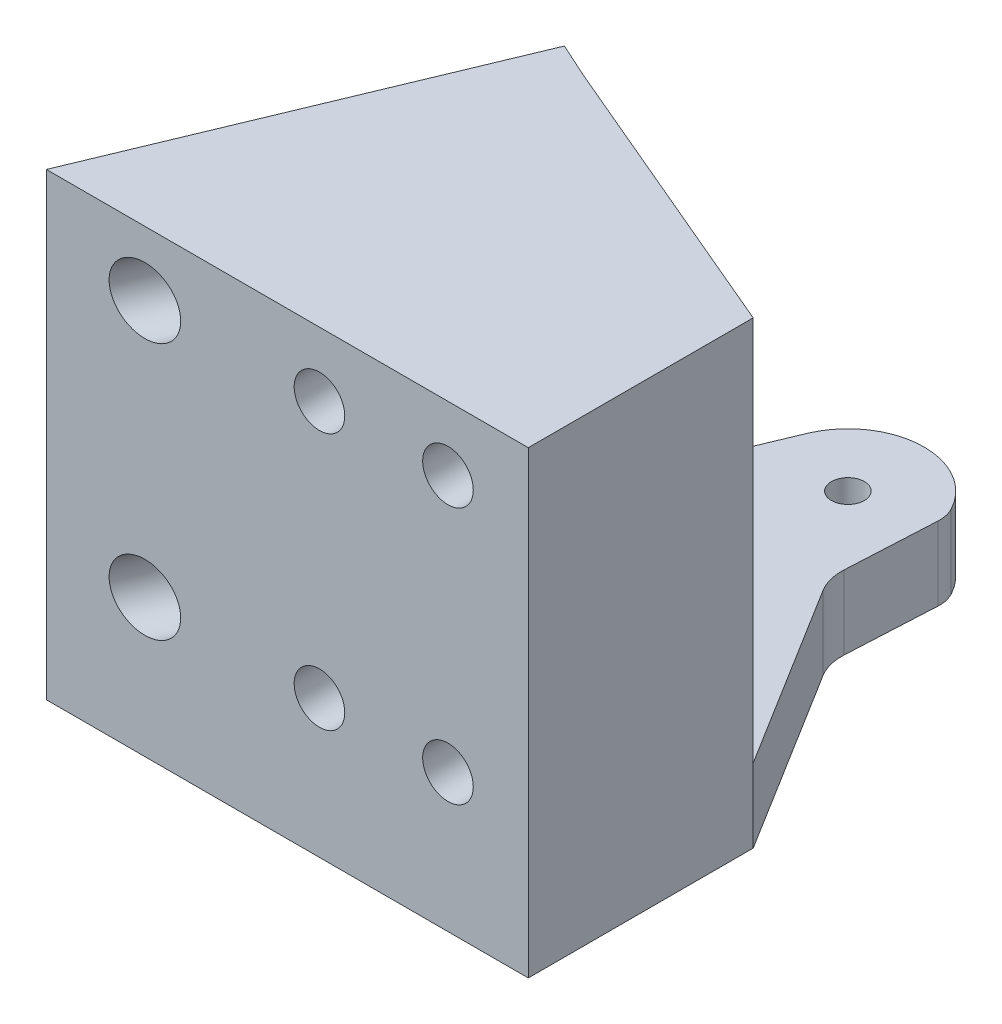
ISO-10303-21;
HEADER;
FILE_DESCRIPTION(('STEP AP214'),'2;1');
FILE_NAME('part.step','',(''),(''),'','','');
FILE_SCHEMA(('AUTOMOTIVE_DESIGN { 1 0 10303 214 1 1 1 1 }'));
ENDSEC;
DATA;
#1=APPLICATION_CONTEXT('core data for automotive mechanical design processes');
#2=APPLICATION_PROTOCOL_DEFINITION('international standard','automotive_design',2000,#1);
#3=PRODUCT_CONTEXT('',#1,'mechanical');
#4=PRODUCT('Part','Part','',(#3));
#5=PRODUCT_RELATED_PRODUCT_CATEGORY('part','',(#4));
#6=PRODUCT_DEFINITION_FORMATION('','',#4);
#7=PRODUCT_DEFINITION_CONTEXT('part definition',#1,'design');
#8=PRODUCT_DEFINITION('design','',#6,#7);
#9=PRODUCT_DEFINITION_SHAPE('','',#8);
#10=(LENGTH_UNIT() NAMED_UNIT(*) SI_UNIT(.MILLI.,.METRE.));
#11=(NAMED_UNIT(*) PLANE_ANGLE_UNIT() SI_UNIT($,.RADIAN.));
#12=(NAMED_UNIT(*) SI_UNIT($,.STERADIAN.) SOLID_ANGLE_UNIT());
#13=UNCERTAINTY_MEASURE_WITH_UNIT(LENGTH_MEASURE(1.E-05),#10,'distance_accuracy_value','');
#14=(GEOMETRIC_REPRESENTATION_CONTEXT(3) GLOBAL_UNCERTAINTY_ASSIGNED_CONTEXT((#13)) GLOBAL_UNIT_ASSIGNED_CONTEXT((#10,
#11,#12)) REPRESENTATION_CONTEXT('',''));
#15=CARTESIAN_POINT('',(0.,0.,0.));
#16=DIRECTION('',(0.,0.,1.));
#17=DIRECTION('',(1.,0.,0.));
#18=AXIS2_PLACEMENT_3D('',#15,#16,#17);
#19=CARTESIAN_POINT('',(0.,0.,0.));
#20=DIRECTION('',(0.,-1.,0.));
#21=DIRECTION('',(0.,0.,-1.));
#22=AXIS2_PLACEMENT_3D('',#19,#20,#21);
#23=PLANE('',#22);
#24=CARTESIAN_POINT('',(13.39,0.,-19.59));
#25=DIRECTION('',(0.,-1.,0.));
#26=DIRECTION('',(0.,0.,-1.));
#27=AXIS2_PLACEMENT_3D('',#24,#25,#26);
#28=CIRCLE('',#27,2.05);
#29=CARTESIAN_POINT('',(13.39,0.,-21.64));
#30=VERTEX_POINT('',#29);
#31=EDGE_CURVE('E172',#30,#30,#28,.T.);
#32=ORIENTED_EDGE('',*,*,#31,.T.);
#33=EDGE_LOOP('',(#32));
#34=FACE_BOUND('',#33,.T.);
#35=DIRECTION('',(-0.910085172918903,0.,-0.414421256734219));
#36=VECTOR('',#35,1.);
#37=CARTESIAN_POINT('',(0.,0.,0.));
#38=LINE('',#37,#36);
#39=CARTESIAN_POINT('',(0.,0.,0.));
#40=VERTEX_POINT('',#39);
#41=CARTESIAN_POINT('',(-4.23961622686856,0.,-1.93057434303044));
#42=VERTEX_POINT('',#41);
#43=EDGE_CURVE('E151',#40,#42,#38,.T.);
#44=ORIENTED_EDGE('',*,*,#43,.F.);
#45=DIRECTION('',(-0.920504853452443,0.,-0.390731128489268));
#46=VECTOR('',#45,1.);
#47=CARTESIAN_POINT('',(36.8201941380977,0.,15.6292451395707));
#48=LINE('',#47,#46);
#49=CARTESIAN_POINT('',(36.8201941380977,0.,15.6292451395707));
#50=VERTEX_POINT('',#49);
#51=EDGE_CURVE('E225',#50,#40,#48,.T.);
#52=ORIENTED_EDGE('',*,*,#51,.F.);
#53=DIRECTION('',(0.527710960217974,0.,0.849424006292396));
#54=VECTOR('',#53,1.);
#55=CARTESIAN_POINT('',(19.5607338113645,0.,-12.1522508731759));
#56=LINE('',#55,#54);
#57=CARTESIAN_POINT('',(22.5481581017996,0.,-7.34357699566459));
#58=VERTEX_POINT('',#57);
#59=EDGE_CURVE('E196',#58,#50,#56,.T.);
#60=ORIENTED_EDGE('',*,*,#59,.F.);
#61=CARTESIAN_POINT('',(27.644702139554,0.,-10.5098427569724));
#62=DIRECTION('',(0.,-1.,0.));
#63=DIRECTION('',(0.,0.,-1.));
#64=AXIS2_PLACEMENT_3D('',#61,#62,#63);
#65=CIRCLE('',#64,6.);
#66=CARTESIAN_POINT('',(21.6527019401257,0.,-10.8195742698201));
#67=VERTEX_POINT('',#66);
#68=EDGE_CURVE('E49',#58,#67,#65,.T.);
#69=ORIENTED_EDGE('',*,*,#68,.T.);
#70=DIRECTION('',(-0.051621918807937,0.,0.998666699904721));
#71=VECTOR('',#70,1.);
#72=CARTESIAN_POINT('',(21.0372188326345,0.,1.0874314750123));
#73=LINE('',#72,#71);
#74=CARTESIAN_POINT('',(22.2299105121146,0.,-21.9861289631768));
#75=VERTEX_POINT('',#74);
#76=EDGE_CURVE('E194',#75,#67,#73,.T.);
#77=ORIENTED_EDGE('',*,*,#76,.F.);
#78=CARTESIAN_POINT('',(18.2352437124957,0.,-22.1926166384086));
#79=DIRECTION('',(0.,-1.,0.));
#80=DIRECTION('',(0.,0.,-1.));
#81=AXIS2_PLACEMENT_3D('',#78,#79,#80);
#82=CIRCLE('',#81,4.);
#83=CARTESIAN_POINT('',(21.7590573215834,0.,-24.0854287390694));
#84=VERTEX_POINT('',#83);
#85=EDGE_CURVE('E252',#75,#84,#82,.F.);
#86=ORIENTED_EDGE('',*,*,#85,.T.);
#87=CARTESIAN_POINT('',(13.39,0.,-19.59));
#88=DIRECTION('',(0.,-1.,0.));
#89=DIRECTION('',(0.,0.,-1.));
#90=AXIS2_PLACEMENT_3D('',#87,#88,#89);
#91=CIRCLE('',#90,9.50000000000001);
#92=CARTESIAN_POINT('',(4.61782799973068,0.,-23.2367791813724));
#93=VERTEX_POINT('',#92);
#94=EDGE_CURVE('E190',#93,#84,#91,.T.);
#95=ORIENTED_EDGE('',*,*,#94,.F.);
#96=DIRECTION('',(0.383871492776041,0.,-0.923386526344138));
#97=VECTOR('',#96,1.);
#98=CARTESIAN_POINT('',(-4.29919251697204,0.,-1.78726611460927));
#99=LINE('',#98,#97);
#100=EDGE_CURVE('E188',#42,#93,#99,.T.);
#101=ORIENTED_EDGE('',*,*,#100,.F.);
#102=EDGE_LOOP('',(#44,#52,#60,#69,#77,#86,#95,#101));
#103=FACE_BOUND('',#102,.T.);
#104=ADVANCED_FACE('F40',(#34,#103),#23,.F.);
#105=CARTESIAN_POINT('',(36.8201941380977,48.,15.6292451395707));
#106=DIRECTION('',(-0.390731128489268,0.,0.920504853452443));
#107=DIRECTION('',(0.920504853452443,0.,0.390731128489268));
#108=AXIS2_PLACEMENT_3D('',#105,#106,#107);
#109=PLANE('',#108);
#110=CARTESIAN_POINT('',(6.44353397416709,40.,2.73511789942487));
#111=DIRECTION('',(0.390731128489268,0.,-0.920504853452443));
#112=DIRECTION('',(-0.920504853452443,0.,-0.390731128489268));
#113=AXIS2_PLACEMENT_3D('',#110,#111,#112);
#114=CIRCLE('',#113,2.05);
#115=CARTESIAN_POINT('',(4.55649902458958,40.,1.93411908602187));
#116=VERTEX_POINT('',#115);
#117=EDGE_CURVE('E270',#116,#116,#114,.T.);
#118=ORIENTED_EDGE('',*,*,#117,.F.);
#119=EDGE_LOOP('',(#118));
#120=FACE_BOUND('',#119,.T.);
#121=CARTESIAN_POINT('',(6.44353397416709,8.,2.73511789942487));
#122=DIRECTION('',(0.390731128489268,0.,-0.920504853452443));
#123=DIRECTION('',(-0.920504853452443,0.,-0.390731128489268));
#124=AXIS2_PLACEMENT_3D('',#121,#122,#123);
#125=CIRCLE('',#124,2.05);
#126=CARTESIAN_POINT('',(4.55649902458958,8.,1.93411908602187));
#127=VERTEX_POINT('',#126);
#128=EDGE_CURVE('E276',#127,#127,#125,.T.);
#129=ORIENTED_EDGE('',*,*,#128,.F.);
#130=EDGE_LOOP('',(#129));
#131=FACE_BOUND('',#130,.T.);
#132=ORIENTED_EDGE('',*,*,#51,.T.);
#133=DIRECTION('',(0.,-1.,0.));
#134=VECTOR('',#133,1.);
#135=CARTESIAN_POINT('',(0.,48.,0.));
#136=LINE('',#135,#134);
#137=CARTESIAN_POINT('',(0.,48.,0.));
#138=VERTEX_POINT('',#137);
#139=EDGE_CURVE('E236',#138,#40,#136,.T.);
#140=ORIENTED_EDGE('',*,*,#139,.F.);
#141=DIRECTION('',(-0.920504853452443,0.,-0.390731128489268));
#142=VECTOR('',#141,1.);
#143=CARTESIAN_POINT('',(36.8201941380977,48.,15.6292451395707));
#144=LINE('',#143,#142);
#145=CARTESIAN_POINT('',(36.8201941380977,48.,15.6292451395707));
#146=VERTEX_POINT('',#145);
#147=EDGE_CURVE('E132',#146,#138,#144,.T.);
#148=ORIENTED_EDGE('',*,*,#147,.F.);
#149=DIRECTION('',(0.,-1.,0.));
#150=VECTOR('',#149,1.);
#151=CARTESIAN_POINT('',(36.8201941380977,48.,15.6292451395707));
#152=LINE('',#151,#150);
#153=EDGE_CURVE('E230',#146,#50,#152,.T.);
#154=ORIENTED_EDGE('',*,*,#153,.T.);
#155=EDGE_LOOP('',(#132,#140,#148,#154));
#156=FACE_BOUND('',#155,.T.);
#157=ADVANCED_FACE('F293',(#120,#131,#156),#109,.F.);
#158=CARTESIAN_POINT('',(0.,48.,43.6292451395707));
#159=DIRECTION('',(0.,0.,-1.));
#160=DIRECTION('',(-1.,0.,0.));
#161=AXIS2_PLACEMENT_3D('',#158,#159,#160);
#162=PLANE('',#161);
#163=CARTESIAN_POINT('',(-10.9149931701457,40.,43.6292451395707));
#164=DIRECTION('',(0.,0.,-1.));
#165=DIRECTION('',(1.,0.,0.));
#166=AXIS2_PLACEMENT_3D('',#163,#164,#165);
#167=ELLIPSE('',#166,4.4540775473617,4.1);
#168=CARTESIAN_POINT('',(-6.460915622784,40.,43.6292451395707));
#169=VERTEX_POINT('',#168);
#170=EDGE_CURVE('E153',#169,#169,#167,.T.);
#171=ORIENTED_EDGE('',*,*,#170,.T.);
#172=EDGE_LOOP('',(#171));
#173=FACE_BOUND('',#172,.T.);
#174=CARTESIAN_POINT('',(-10.9149931701457,8.,43.6292451395707));
#175=DIRECTION('',(0.,0.,-1.));
#176=DIRECTION('',(1.,0.,0.));
#177=AXIS2_PLACEMENT_3D('',#174,#175,#176);
#178=ELLIPSE('',#177,4.4540775473617,4.1);
#179=CARTESIAN_POINT('',(-6.460915622784,8.,43.6292451395707));
#180=VERTEX_POINT('',#179);
#181=EDGE_CURVE('E263',#180,#180,#178,.T.);
#182=ORIENTED_EDGE('',*,*,#181,.T.);
#183=EDGE_LOOP('',(#182));
#184=FACE_BOUND('',#183,.T.);
#185=CARTESIAN_POINT('',(10.8201941380977,8.,43.6292451395707));
#186=DIRECTION('',(0.,0.,1.));
#187=DIRECTION('',(1.,0.,0.));
#188=AXIS2_PLACEMENT_3D('',#185,#186,#187);
#189=CIRCLE('',#188,3.15);
#190=CARTESIAN_POINT('',(13.9701941380977,8.,43.6292451395707));
#191=VERTEX_POINT('',#190);
#192=EDGE_CURVE('E142',#191,#191,#189,.T.);
#193=ORIENTED_EDGE('',*,*,#192,.F.);
#194=EDGE_LOOP('',(#193));
#195=FACE_BOUND('',#194,.T.);
#196=CARTESIAN_POINT('',(26.8201941380977,8.,43.6292451395707));
#197=DIRECTION('',(0.,0.,1.));
#198=DIRECTION('',(1.,0.,0.));
#199=AXIS2_PLACEMENT_3D('',#196,#197,#198);
#200=CIRCLE('',#199,3.14999999999998);
#201=CARTESIAN_POINT('',(29.9701941380977,8.,43.6292451395707));
#202=VERTEX_POINT('',#201);
#203=EDGE_CURVE('E214',#202,#202,#200,.T.);
#204=ORIENTED_EDGE('',*,*,#203,.F.);
#205=EDGE_LOOP('',(#204));
#206=FACE_BOUND('',#205,.T.);
#207=CARTESIAN_POINT('',(26.8201941380977,40.,43.6292451395707));
#208=DIRECTION('',(0.,0.,1.));
#209=DIRECTION('',(1.,0.,0.));
#210=AXIS2_PLACEMENT_3D('',#207,#208,#209);
#211=CIRCLE('',#210,3.14999999999998);
#212=CARTESIAN_POINT('',(29.9701941380977,40.,43.6292451395707));
#213=VERTEX_POINT('',#212);
#214=EDGE_CURVE('E208',#213,#213,#211,.T.);
#215=ORIENTED_EDGE('',*,*,#214,.F.);
#216=EDGE_LOOP('',(#215));
#217=FACE_BOUND('',#216,.T.);
#218=CARTESIAN_POINT('',(10.8201941380977,40.,43.6292451395707));
#219=DIRECTION('',(0.,0.,1.));
#220=DIRECTION('',(1.,0.,0.));
#221=AXIS2_PLACEMENT_3D('',#218,#219,#220);
#222=CIRCLE('',#221,3.15);
#223=CARTESIAN_POINT('',(13.9701941380977,40.,43.6292451395707));
#224=VERTEX_POINT('',#223);
#225=EDGE_CURVE('E207',#224,#224,#222,.T.);
#226=ORIENTED_EDGE('',*,*,#225,.F.);
#227=EDGE_LOOP('',(#226));
#228=FACE_BOUND('',#227,.T.);
#229=DIRECTION('',(1.,0.,0.));
#230=VECTOR('',#229,1.);
#231=CARTESIAN_POINT('',(0.,48.,43.6292451395707));
#232=LINE('',#231,#230);
#233=CARTESIAN_POINT('',(-23.1798058619023,48.,43.6292451395707));
#234=VERTEX_POINT('',#233);
#235=CARTESIAN_POINT('',(36.8201941380977,48.,43.6292451395707));
#236=VERTEX_POINT('',#235);
#237=EDGE_CURVE('E122',#234,#236,#232,.T.);
#238=ORIENTED_EDGE('',*,*,#237,.F.);
#239=DIRECTION('',(0.,1.,0.));
#240=VECTOR('',#239,1.);
#241=CARTESIAN_POINT('',(-23.1798058619023,-9.18,43.6292451395707));
#242=LINE('',#241,#240);
#243=CARTESIAN_POINT('',(-23.1798058619023,-9.18,43.6292451395707));
#244=VERTEX_POINT('',#243);
#245=EDGE_CURVE('E126',#244,#234,#242,.T.);
#246=ORIENTED_EDGE('',*,*,#245,.F.);
#247=DIRECTION('',(-1.,0.,0.));
#248=VECTOR('',#247,1.);
#249=CARTESIAN_POINT('',(0.,-9.18,43.6292451395707));
#250=LINE('',#249,#248);
#251=CARTESIAN_POINT('',(36.8201941380977,-9.18,43.6292451395707));
#252=VERTEX_POINT('',#251);
#253=EDGE_CURVE('E170',#252,#244,#250,.T.);
#254=ORIENTED_EDGE('',*,*,#253,.F.);
#255=DIRECTION('',(0.,-1.,0.));
#256=VECTOR('',#255,1.);
#257=CARTESIAN_POINT('',(36.8201941380977,48.,43.6292451395707));
#258=LINE('',#257,#256);
#259=EDGE_CURVE('E127',#236,#252,#258,.T.);
#260=ORIENTED_EDGE('',*,*,#259,.F.);
#261=EDGE_LOOP('',(#238,#246,#254,#260));
#262=FACE_BOUND('',#261,.T.);
#263=ADVANCED_FACE('F124',(#173,#184,#195,#206,#217,#228,#262),#162,.F.);
#264=CARTESIAN_POINT('',(36.8201941380977,48.,15.6292451395707));
#265=DIRECTION('',(-1.,0.,0.));
#266=DIRECTION('',(0.,0.,1.));
#267=AXIS2_PLACEMENT_3D('',#264,#265,#266);
#268=PLANE('',#267);
#269=ORIENTED_EDGE('',*,*,#259,.T.);
#270=DIRECTION('',(0.,0.,1.));
#271=VECTOR('',#270,1.);
#272=CARTESIAN_POINT('',(36.8201941380977,-9.18,0.));
#273=LINE('',#272,#271);
#274=CARTESIAN_POINT('',(36.8201941380977,-9.18,15.6292451395707));
#275=VERTEX_POINT('',#274);
#276=EDGE_CURVE('E181',#275,#252,#273,.T.);
#277=ORIENTED_EDGE('',*,*,#276,.F.);
#278=DIRECTION('',(0.,1.,0.));
#279=VECTOR('',#278,1.);
#280=CARTESIAN_POINT('',(36.8201941380977,-9.18,15.6292451395707));
#281=LINE('',#280,#279);
#282=EDGE_CURVE('E187',#275,#50,#281,.T.);
#283=ORIENTED_EDGE('',*,*,#282,.T.);
#284=ORIENTED_EDGE('',*,*,#153,.F.);
#285=DIRECTION('',(0.,0.,-1.));
#286=VECTOR('',#285,1.);
#287=CARTESIAN_POINT('',(36.8201941380977,48.,15.6292451395707));
#288=LINE('',#287,#286);
#289=EDGE_CURVE('E131',#236,#146,#288,.T.);
#290=ORIENTED_EDGE('',*,*,#289,.F.);
#291=EDGE_LOOP('',(#269,#277,#283,#284,#290));
#292=FACE_BOUND('',#291,.T.);
#293=ADVANCED_FACE('F297',(#292),#268,.F.);
#294=CARTESIAN_POINT('',(0.,48.,0.));
#295=DIRECTION('',(0.,1.,0.));
#296=DIRECTION('',(0.,0.,1.));
#297=AXIS2_PLACEMENT_3D('',#294,#295,#296);
#298=PLANE('',#297);
#299=ORIENTED_EDGE('',*,*,#147,.T.);
#300=DIRECTION('',(-0.910085172918903,0.,-0.414421256734219));
#301=VECTOR('',#300,1.);
#302=CARTESIAN_POINT('',(0.,48.,0.));
#303=LINE('',#302,#301);
#304=CARTESIAN_POINT('',(-4.23961622686856,48.,-1.93057434303044));
#305=VERTEX_POINT('',#304);
#306=EDGE_CURVE('E147',#138,#305,#303,.T.);
#307=ORIENTED_EDGE('',*,*,#306,.T.);
#308=DIRECTION('',(0.383871492776041,0.,-0.923386526344138));
#309=VECTOR('',#308,1.);
#310=CARTESIAN_POINT('',(-4.29919251697204,48.,-1.78726611460927));
#311=LINE('',#310,#309);
#312=EDGE_CURVE('E138',#234,#305,#311,.T.);
#313=ORIENTED_EDGE('',*,*,#312,.F.);
#314=ORIENTED_EDGE('',*,*,#237,.T.);
#315=ORIENTED_EDGE('',*,*,#289,.T.);
#316=EDGE_LOOP('',(#299,#307,#313,#314,#315));
#317=FACE_BOUND('',#316,.T.);
#318=ADVANCED_FACE('F145',(#317),#298,.T.);
#319=CARTESIAN_POINT('',(10.8201941380977,40.,38.9292451395707));
#320=DIRECTION('',(0.,0.,1.));
#321=DIRECTION('',(1.,0.,0.));
#322=AXIS2_PLACEMENT_3D('',#319,#320,#321);
#323=CYLINDRICAL_SURFACE('',#322,3.15);
#324=CARTESIAN_POINT('',(10.8201941380977,40.,38.9292451395707));
#325=DIRECTION('',(0.,0.,1.));
#326=DIRECTION('',(1.,0.,0.));
#327=AXIS2_PLACEMENT_3D('',#324,#325,#326);
#328=CIRCLE('',#327,3.15);
#329=CARTESIAN_POINT('',(13.9701941380977,40.,38.9292451395707));
#330=VERTEX_POINT('',#329);
#331=EDGE_CURVE('E222',#330,#330,#328,.T.);
#332=ORIENTED_EDGE('',*,*,#331,.F.);
#333=EDGE_LOOP('',(#332));
#334=FACE_BOUND('',#333,.T.);
#335=ORIENTED_EDGE('',*,*,#225,.T.);
#336=EDGE_LOOP('',(#335));
#337=FACE_BOUND('',#336,.T.);
#338=ADVANCED_FACE('F519',(#334,#337),#323,.F.);
#339=CARTESIAN_POINT('',(0.,0.,38.9292451395707));
#340=DIRECTION('',(0.,0.,1.));
#341=DIRECTION('',(1.,0.,0.));
#342=AXIS2_PLACEMENT_3D('',#339,#340,#341);
#343=PLANE('',#342);
#344=CARTESIAN_POINT('',(10.8201941380977,40.,38.9292451395707));
#345=DIRECTION('',(0.,0.,1.));
#346=DIRECTION('',(1.,0.,0.));
#347=AXIS2_PLACEMENT_3D('',#344,#345,#346);
#348=CIRCLE('',#347,2.);
#349=CARTESIAN_POINT('',(12.8201941380977,40.,38.9292451395707));
#350=VERTEX_POINT('',#349);
#351=EDGE_CURVE('E191',#350,#350,#348,.T.);
#352=ORIENTED_EDGE('',*,*,#351,.F.);
#353=EDGE_LOOP('',(#352));
#354=FACE_BOUND('',#353,.T.);
#355=ORIENTED_EDGE('',*,*,#331,.T.);
#356=EDGE_LOOP('',(#355));
#357=FACE_BOUND('',#356,.T.);
#358=ADVANCED_FACE('F610',(#354,#357),#343,.T.);
#359=CARTESIAN_POINT('',(26.8201941380977,40.,38.9292451395707));
#360=DIRECTION('',(0.,0.,1.));
#361=DIRECTION('',(1.,0.,0.));
#362=AXIS2_PLACEMENT_3D('',#359,#360,#361);
#363=CYLINDRICAL_SURFACE('',#362,3.14999999999998);
#364=CARTESIAN_POINT('',(26.8201941380977,40.,38.9292451395707));
#365=DIRECTION('',(0.,0.,1.));
#366=DIRECTION('',(1.,0.,0.));
#367=AXIS2_PLACEMENT_3D('',#364,#365,#366);
#368=CIRCLE('',#367,3.14999999999998);
#369=CARTESIAN_POINT('',(29.9701941380977,40.,38.9292451395707));
#370=VERTEX_POINT('',#369);
#371=EDGE_CURVE('E204',#370,#370,#368,.T.);
#372=ORIENTED_EDGE('',*,*,#371,.F.);
#373=EDGE_LOOP('',(#372));
#374=FACE_BOUND('',#373,.T.);
#375=ORIENTED_EDGE('',*,*,#214,.T.);
#376=EDGE_LOOP('',(#375));
#377=FACE_BOUND('',#376,.T.);
#378=ADVANCED_FACE('F617',(#374,#377),#363,.F.);
#379=CARTESIAN_POINT('',(0.,0.,38.9292451395707));
#380=DIRECTION('',(0.,0.,1.));
#381=DIRECTION('',(1.,0.,0.));
#382=AXIS2_PLACEMENT_3D('',#379,#380,#381);
#383=PLANE('',#382);
#384=CARTESIAN_POINT('',(26.8201941380977,40.,38.9292451395707));
#385=DIRECTION('',(0.,0.,1.));
#386=DIRECTION('',(1.,0.,0.));
#387=AXIS2_PLACEMENT_3D('',#384,#385,#386);
#388=CIRCLE('',#387,2.);
#389=CARTESIAN_POINT('',(28.8201941380977,40.,38.9292451395707));
#390=VERTEX_POINT('',#389);
#391=EDGE_CURVE('E245',#390,#390,#388,.T.);
#392=ORIENTED_EDGE('',*,*,#391,.F.);
#393=EDGE_LOOP('',(#392));
#394=FACE_BOUND('',#393,.T.);
#395=ORIENTED_EDGE('',*,*,#371,.T.);
#396=EDGE_LOOP('',(#395));
#397=FACE_BOUND('',#396,.T.);
#398=ADVANCED_FACE('F625',(#394,#397),#383,.T.);
#399=CARTESIAN_POINT('',(26.8201941380977,8.,38.9292451395707));
#400=DIRECTION('',(0.,0.,1.));
#401=DIRECTION('',(1.,0.,0.));
#402=AXIS2_PLACEMENT_3D('',#399,#400,#401);
#403=CYLINDRICAL_SURFACE('',#402,3.14999999999998);
#404=CARTESIAN_POINT('',(26.8201941380977,8.,38.9292451395707));
#405=DIRECTION('',(0.,0.,1.));
#406=DIRECTION('',(1.,0.,0.));
#407=AXIS2_PLACEMENT_3D('',#404,#405,#406);
#408=CIRCLE('',#407,3.14999999999998);
#409=CARTESIAN_POINT('',(29.9701941380977,8.,38.9292451395707));
#410=VERTEX_POINT('',#409);
#411=EDGE_CURVE('E211',#410,#410,#408,.T.);
#412=ORIENTED_EDGE('',*,*,#411,.F.);
#413=EDGE_LOOP('',(#412));
#414=FACE_BOUND('',#413,.T.);
#415=ORIENTED_EDGE('',*,*,#203,.T.);
#416=EDGE_LOOP('',(#415));
#417=FACE_BOUND('',#416,.T.);
#418=ADVANCED_FACE('F633',(#414,#417),#403,.F.);
#419=CARTESIAN_POINT('',(0.,0.,38.9292451395707));
#420=DIRECTION('',(0.,0.,1.));
#421=DIRECTION('',(1.,0.,0.));
#422=AXIS2_PLACEMENT_3D('',#419,#420,#421);
#423=PLANE('',#422);
#424=CARTESIAN_POINT('',(26.8201941380977,8.,38.9292451395707));
#425=DIRECTION('',(0.,0.,1.));
#426=DIRECTION('',(1.,0.,0.));
#427=AXIS2_PLACEMENT_3D('',#424,#425,#426);
#428=CIRCLE('',#427,2.);
#429=CARTESIAN_POINT('',(28.8201941380977,8.,38.9292451395707));
#430=VERTEX_POINT('',#429);
#431=EDGE_CURVE('E242',#430,#430,#428,.T.);
#432=ORIENTED_EDGE('',*,*,#431,.F.);
#433=EDGE_LOOP('',(#432));
#434=FACE_BOUND('',#433,.T.);
#435=ORIENTED_EDGE('',*,*,#411,.T.);
#436=EDGE_LOOP('',(#435));
#437=FACE_BOUND('',#436,.T.);
#438=ADVANCED_FACE('F641',(#434,#437),#423,.T.);
#439=CARTESIAN_POINT('',(10.8201941380977,8.,38.9292451395707));
#440=DIRECTION('',(0.,0.,1.));
#441=DIRECTION('',(1.,0.,0.));
#442=AXIS2_PLACEMENT_3D('',#439,#440,#441);
#443=CYLINDRICAL_SURFACE('',#442,3.15);
#444=CARTESIAN_POINT('',(10.8201941380977,8.,38.9292451395707));
#445=DIRECTION('',(0.,0.,1.));
#446=DIRECTION('',(1.,0.,0.));
#447=AXIS2_PLACEMENT_3D('',#444,#445,#446);
#448=CIRCLE('',#447,3.15);
#449=CARTESIAN_POINT('',(13.9701941380977,8.,38.9292451395707));
#450=VERTEX_POINT('',#449);
#451=EDGE_CURVE('E217',#450,#450,#448,.T.);
#452=ORIENTED_EDGE('',*,*,#451,.F.);
#453=EDGE_LOOP('',(#452));
#454=FACE_BOUND('',#453,.T.);
#455=ORIENTED_EDGE('',*,*,#192,.T.);
#456=EDGE_LOOP('',(#455));
#457=FACE_BOUND('',#456,.T.);
#458=ADVANCED_FACE('F648',(#454,#457),#443,.F.);
#459=CARTESIAN_POINT('',(0.,0.,38.9292451395707));
#460=DIRECTION('',(0.,0.,1.));
#461=DIRECTION('',(1.,0.,0.));
#462=AXIS2_PLACEMENT_3D('',#459,#460,#461);
#463=PLANE('',#462);
#464=CARTESIAN_POINT('',(10.8201941380977,8.,38.9292451395707));
#465=DIRECTION('',(0.,0.,1.));
#466=DIRECTION('',(1.,0.,0.));
#467=AXIS2_PLACEMENT_3D('',#464,#465,#466);
#468=CIRCLE('',#467,2.);
#469=CARTESIAN_POINT('',(12.8201941380977,8.,38.9292451395707));
#470=VERTEX_POINT('',#469);
#471=EDGE_CURVE('E169',#470,#470,#468,.T.);
#472=ORIENTED_EDGE('',*,*,#471,.F.);
#473=EDGE_LOOP('',(#472));
#474=FACE_BOUND('',#473,.T.);
#475=ORIENTED_EDGE('',*,*,#451,.T.);
#476=EDGE_LOOP('',(#475));
#477=FACE_BOUND('',#476,.T.);
#478=ADVANCED_FACE('F325',(#474,#477),#463,.T.);
#479=CARTESIAN_POINT('',(-4.29919251697204,-9.18,-1.78726611460927));
#480=DIRECTION('',(0.923386526344138,0.,0.383871492776041));
#481=DIRECTION('',(0.383871492776041,0.,-0.923386526344138));
#482=AXIS2_PLACEMENT_3D('',#479,#480,#481);
#483=PLANE('',#482);
#484=ORIENTED_EDGE('',*,*,#245,.T.);
#485=ORIENTED_EDGE('',*,*,#312,.T.);
#486=DIRECTION('',(0.,-1.,0.));
#487=VECTOR('',#486,1.);
#488=CARTESIAN_POINT('',(-4.23961622686856,99.1175170668792,-1.93057434303044));
#489=LINE('',#488,#487);
#490=EDGE_CURVE('E149',#305,#42,#489,.T.);
#491=ORIENTED_EDGE('',*,*,#490,.T.);
#492=ORIENTED_EDGE('',*,*,#100,.T.);
#493=DIRECTION('',(0.,1.,0.));
#494=VECTOR('',#493,1.);
#495=CARTESIAN_POINT('',(4.61782799973068,-9.18,-23.2367791813724));
#496=LINE('',#495,#494);
#497=CARTESIAN_POINT('',(4.61782799973068,-9.18,-23.2367791813724));
#498=VERTEX_POINT('',#497);
#499=EDGE_CURVE('E143',#498,#93,#496,.T.);
#500=ORIENTED_EDGE('',*,*,#499,.F.);
#501=DIRECTION('',(0.383871492776041,0.,-0.923386526344138));
#502=VECTOR('',#501,1.);
#503=CARTESIAN_POINT('',(-4.29919251697204,-9.18,-1.78726611460927));
#504=LINE('',#503,#502);
#505=EDGE_CURVE('E140',#244,#498,#504,.T.);
#506=ORIENTED_EDGE('',*,*,#505,.F.);
#507=EDGE_LOOP('',(#484,#485,#491,#492,#500,#506));
#508=FACE_BOUND('',#507,.T.);
#509=ADVANCED_FACE('F136',(#508),#483,.F.);
#510=CARTESIAN_POINT('',(13.39,-9.18,-19.59));
#511=DIRECTION('',(0.,1.,0.));
#512=DIRECTION('',(0.,0.,1.));
#513=AXIS2_PLACEMENT_3D('',#510,#511,#512);
#514=CYLINDRICAL_SURFACE('',#513,9.50000000000001);
#515=ORIENTED_EDGE('',*,*,#94,.T.);
#516=DIRECTION('',(0.,1.,0.));
#517=VECTOR('',#516,1.);
#518=CARTESIAN_POINT('',(21.7590573215834,-9.18,-24.0854287390694));
#519=LINE('',#518,#517);
#520=CARTESIAN_POINT('',(21.7590573215834,-9.18,-24.0854287390694));
#521=VERTEX_POINT('',#520);
#522=EDGE_CURVE('E254',#84,#521,#519,.F.);
#523=ORIENTED_EDGE('',*,*,#522,.T.);
#524=CARTESIAN_POINT('',(13.39,-9.18,-19.59));
#525=DIRECTION('',(0.,-1.,0.));
#526=DIRECTION('',(0.,0.,-1.));
#527=AXIS2_PLACEMENT_3D('',#524,#525,#526);
#528=CIRCLE('',#527,9.50000000000001);
#529=EDGE_CURVE('E174',#498,#521,#528,.T.);
#530=ORIENTED_EDGE('',*,*,#529,.F.);
#531=ORIENTED_EDGE('',*,*,#499,.T.);
#532=EDGE_LOOP('',(#515,#523,#530,#531));
#533=FACE_BOUND('',#532,.T.);
#534=ADVANCED_FACE('F316',(#533),#514,.T.);
#535=CARTESIAN_POINT('',(21.0372188326345,-9.18,1.0874314750123));
#536=DIRECTION('',(-0.998666699904721,0.,-0.051621918807937));
#537=DIRECTION('',(-0.051621918807937,0.,0.998666699904721));
#538=AXIS2_PLACEMENT_3D('',#535,#536,#537);
#539=PLANE('',#538);
#540=ORIENTED_EDGE('',*,*,#76,.T.);
#541=DIRECTION('',(0.,1.,0.));
#542=VECTOR('',#541,1.);
#543=CARTESIAN_POINT('',(21.6527019401257,-9.18,-10.8195742698201));
#544=LINE('',#543,#542);
#545=CARTESIAN_POINT('',(21.6527019401257,-9.18,-10.8195742698201));
#546=VERTEX_POINT('',#545);
#547=EDGE_CURVE('E63',#67,#546,#544,.F.);
#548=ORIENTED_EDGE('',*,*,#547,.T.);
#549=DIRECTION('',(-0.051621918807937,0.,0.998666699904721));
#550=VECTOR('',#549,1.);
#551=CARTESIAN_POINT('',(21.0372188326345,-9.18,1.0874314750123));
#552=LINE('',#551,#550);
#553=CARTESIAN_POINT('',(22.2299105121146,-9.18,-21.9861289631768));
#554=VERTEX_POINT('',#553);
#555=EDGE_CURVE('E177',#554,#546,#552,.T.);
#556=ORIENTED_EDGE('',*,*,#555,.F.);
#557=DIRECTION('',(0.,1.,0.));
#558=VECTOR('',#557,1.);
#559=CARTESIAN_POINT('',(22.2299105121146,-9.18,-21.9861289631768));
#560=LINE('',#559,#558);
#561=EDGE_CURVE('E239',#554,#75,#560,.T.);
#562=ORIENTED_EDGE('',*,*,#561,.T.);
#563=EDGE_LOOP('',(#540,#548,#556,#562));
#564=FACE_BOUND('',#563,.T.);
#565=ADVANCED_FACE('F311',(#564),#539,.F.);
#566=CARTESIAN_POINT('',(19.5607338113645,-9.18,-12.1522508731759));
#567=DIRECTION('',(-0.849424006292396,0.,0.527710960217974));
#568=DIRECTION('',(0.527710960217974,0.,0.849424006292396));
#569=AXIS2_PLACEMENT_3D('',#566,#567,#568);
#570=PLANE('',#569);
#571=DIRECTION('',(0.527710960217974,0.,0.849424006292396));
#572=VECTOR('',#571,1.);
#573=CARTESIAN_POINT('',(19.5607338113645,-9.18,-12.1522508731759));
#574=LINE('',#573,#572);
#575=CARTESIAN_POINT('',(22.5481581017996,-9.18,-7.34357699566459));
#576=VERTEX_POINT('',#575);
#577=EDGE_CURVE('E179',#576,#275,#574,.T.);
#578=ORIENTED_EDGE('',*,*,#577,.F.);
#579=DIRECTION('',(0.,1.,0.));
#580=VECTOR('',#579,1.);
#581=CARTESIAN_POINT('',(22.5481581017996,0.,-7.34357699566459));
#582=LINE('',#581,#580);
#583=EDGE_CURVE('E258',#576,#58,#582,.T.);
#584=ORIENTED_EDGE('',*,*,#583,.T.);
#585=ORIENTED_EDGE('',*,*,#59,.T.);
#586=ORIENTED_EDGE('',*,*,#282,.F.);
#587=EDGE_LOOP('',(#578,#584,#585,#586));
#588=FACE_BOUND('',#587,.T.);
#589=ADVANCED_FACE('F302',(#588),#570,.F.);
#590=CARTESIAN_POINT('',(13.39,-9.18,-19.59));
#591=DIRECTION('',(0.,1.,0.));
#592=DIRECTION('',(0.,0.,1.));
#593=AXIS2_PLACEMENT_3D('',#590,#591,#592);
#594=CYLINDRICAL_SURFACE('',#593,2.05);
#595=CARTESIAN_POINT('',(13.39,-9.18,-19.59));
#596=DIRECTION('',(0.,-1.,0.));
#597=DIRECTION('',(0.,0.,-1.));
#598=AXIS2_PLACEMENT_3D('',#595,#596,#597);
#599=CIRCLE('',#598,2.05);
#600=CARTESIAN_POINT('',(13.39,-9.18,-21.64));
#601=VERTEX_POINT('',#600);
#602=EDGE_CURVE('E184',#601,#601,#599,.T.);
#603=ORIENTED_EDGE('',*,*,#602,.T.);
#604=EDGE_LOOP('',(#603));
#605=FACE_BOUND('',#604,.T.);
#606=ORIENTED_EDGE('',*,*,#31,.F.);
#607=EDGE_LOOP('',(#606));
#608=FACE_BOUND('',#607,.T.);
#609=ADVANCED_FACE('F338',(#605,#608),#594,.F.);
#610=CARTESIAN_POINT('',(0.,-9.18,0.));
#611=DIRECTION('',(0.,-1.,0.));
#612=DIRECTION('',(0.,0.,-1.));
#613=AXIS2_PLACEMENT_3D('',#610,#611,#612);
#614=PLANE('',#613);
#615=ORIENTED_EDGE('',*,*,#529,.T.);
#616=CARTESIAN_POINT('',(18.2352437124957,-9.18,-22.1926166384086));
#617=DIRECTION('',(0.,-1.,0.));
#618=DIRECTION('',(0.,0.,-1.));
#619=AXIS2_PLACEMENT_3D('',#616,#617,#618);
#620=CIRCLE('',#619,4.);
#621=EDGE_CURVE('E256',#521,#554,#620,.T.);
#622=ORIENTED_EDGE('',*,*,#621,.T.);
#623=ORIENTED_EDGE('',*,*,#555,.T.);
#624=CARTESIAN_POINT('',(27.644702139554,-9.18,-10.5098427569724));
#625=DIRECTION('',(0.,-1.,0.));
#626=DIRECTION('',(0.,0.,-1.));
#627=AXIS2_PLACEMENT_3D('',#624,#625,#626);
#628=CIRCLE('',#627,6.);
#629=EDGE_CURVE('E11',#546,#576,#628,.F.);
#630=ORIENTED_EDGE('',*,*,#629,.T.);
#631=ORIENTED_EDGE('',*,*,#577,.T.);
#632=ORIENTED_EDGE('',*,*,#276,.T.);
#633=ORIENTED_EDGE('',*,*,#253,.T.);
#634=ORIENTED_EDGE('',*,*,#505,.T.);
#635=EDGE_LOOP('',(#615,#622,#623,#630,#631,#632,#633,#634));
#636=FACE_BOUND('',#635,.T.);
#637=ORIENTED_EDGE('',*,*,#602,.F.);
#638=EDGE_LOOP('',(#637));
#639=FACE_BOUND('',#638,.T.);
#640=ADVANCED_FACE('F307',(#636,#639),#614,.T.);
#641=CARTESIAN_POINT('',(10.8201941380977,8.,35.6292451395707));
#642=DIRECTION('',(0.,0.,1.));
#643=DIRECTION('',(1.,0.,0.));
#644=AXIS2_PLACEMENT_3D('',#641,#642,#643);
#645=CYLINDRICAL_SURFACE('',#644,2.);
#646=ORIENTED_EDGE('',*,*,#471,.T.);
#647=EDGE_LOOP('',(#646));
#648=FACE_BOUND('',#647,.T.);
#649=CARTESIAN_POINT('',(10.8201941380977,8.,35.6292451395707));
#650=DIRECTION('',(0.,0.,1.));
#651=DIRECTION('',(1.,0.,0.));
#652=AXIS2_PLACEMENT_3D('',#649,#650,#651);
#653=CIRCLE('',#652,2.);
#654=CARTESIAN_POINT('',(12.8201941380977,8.,35.6292451395707));
#655=VERTEX_POINT('',#654);
#656=EDGE_CURVE('E164',#655,#655,#653,.T.);
#657=ORIENTED_EDGE('',*,*,#656,.F.);
#658=EDGE_LOOP('',(#657));
#659=FACE_BOUND('',#658,.T.);
#660=ADVANCED_FACE('F359',(#648,#659),#645,.F.);
#661=CARTESIAN_POINT('',(0.,0.,35.6292451395707));
#662=DIRECTION('',(0.,0.,1.));
#663=DIRECTION('',(1.,0.,0.));
#664=AXIS2_PLACEMENT_3D('',#661,#662,#663);
#665=PLANE('',#664);
#666=ORIENTED_EDGE('',*,*,#656,.T.);
#667=EDGE_LOOP('',(#666));
#668=FACE_BOUND('',#667,.T.);
#669=ADVANCED_FACE('F366',(#668),#665,.T.);
#670=CARTESIAN_POINT('',(26.8201941380977,8.,35.6292451395707));
#671=DIRECTION('',(0.,0.,1.));
#672=DIRECTION('',(1.,0.,0.));
#673=AXIS2_PLACEMENT_3D('',#670,#671,#672);
#674=CYLINDRICAL_SURFACE('',#673,2.);
#675=ORIENTED_EDGE('',*,*,#431,.T.);
#676=EDGE_LOOP('',(#675));
#677=FACE_BOUND('',#676,.T.);
#678=CARTESIAN_POINT('',(26.8201941380977,8.,35.6292451395707));
#679=DIRECTION('',(0.,0.,1.));
#680=DIRECTION('',(1.,0.,0.));
#681=AXIS2_PLACEMENT_3D('',#678,#679,#680);
#682=CIRCLE('',#681,2.);
#683=CARTESIAN_POINT('',(28.8201941380977,8.,35.6292451395707));
#684=VERTEX_POINT('',#683);
#685=EDGE_CURVE('E161',#684,#684,#682,.T.);
#686=ORIENTED_EDGE('',*,*,#685,.F.);
#687=EDGE_LOOP('',(#686));
#688=FACE_BOUND('',#687,.T.);
#689=ADVANCED_FACE('F375',(#677,#688),#674,.F.);
#690=CARTESIAN_POINT('',(0.,0.,35.6292451395707));
#691=DIRECTION('',(0.,0.,1.));
#692=DIRECTION('',(1.,0.,0.));
#693=AXIS2_PLACEMENT_3D('',#690,#691,#692);
#694=PLANE('',#693);
#695=ORIENTED_EDGE('',*,*,#685,.T.);
#696=EDGE_LOOP('',(#695));
#697=FACE_BOUND('',#696,.T.);
#698=ADVANCED_FACE('F383',(#697),#694,.T.);
#699=CARTESIAN_POINT('',(26.8201941380977,40.,35.6292451395707));
#700=DIRECTION('',(0.,0.,1.));
#701=DIRECTION('',(1.,0.,0.));
#702=AXIS2_PLACEMENT_3D('',#699,#700,#701);
#703=CYLINDRICAL_SURFACE('',#702,2.);
#704=ORIENTED_EDGE('',*,*,#391,.T.);
#705=EDGE_LOOP('',(#704));
#706=FACE_BOUND('',#705,.T.);
#707=CARTESIAN_POINT('',(26.8201941380977,40.,35.6292451395707));
#708=DIRECTION('',(0.,0.,1.));
#709=DIRECTION('',(1.,0.,0.));
#710=AXIS2_PLACEMENT_3D('',#707,#708,#709);
#711=CIRCLE('',#710,2.);
#712=CARTESIAN_POINT('',(28.8201941380977,40.,35.6292451395707));
#713=VERTEX_POINT('',#712);
#714=EDGE_CURVE('E157',#713,#713,#711,.T.);
#715=ORIENTED_EDGE('',*,*,#714,.F.);
#716=EDGE_LOOP('',(#715));
#717=FACE_BOUND('',#716,.T.);
#718=ADVANCED_FACE('F391',(#706,#717),#703,.F.);
#719=CARTESIAN_POINT('',(0.,0.,35.6292451395707));
#720=DIRECTION('',(0.,0.,1.));
#721=DIRECTION('',(1.,0.,0.));
#722=AXIS2_PLACEMENT_3D('',#719,#720,#721);
#723=PLANE('',#722);
#724=ORIENTED_EDGE('',*,*,#714,.T.);
#725=EDGE_LOOP('',(#724));
#726=FACE_BOUND('',#725,.T.);
#727=ADVANCED_FACE('F399',(#726),#723,.T.);
#728=CARTESIAN_POINT('',(10.8201941380977,40.,35.6292451395707));
#729=DIRECTION('',(0.,0.,1.));
#730=DIRECTION('',(1.,0.,0.));
#731=AXIS2_PLACEMENT_3D('',#728,#729,#730);
#732=CYLINDRICAL_SURFACE('',#731,2.);
#733=ORIENTED_EDGE('',*,*,#351,.T.);
#734=EDGE_LOOP('',(#733));
#735=FACE_BOUND('',#734,.T.);
#736=CARTESIAN_POINT('',(10.8201941380977,40.,35.6292451395707));
#737=DIRECTION('',(0.,0.,1.));
#738=DIRECTION('',(1.,0.,0.));
#739=AXIS2_PLACEMENT_3D('',#736,#737,#738);
#740=CIRCLE('',#739,2.);
#741=CARTESIAN_POINT('',(12.8201941380977,40.,35.6292451395707));
#742=VERTEX_POINT('',#741);
#743=EDGE_CURVE('E160',#742,#742,#740,.T.);
#744=ORIENTED_EDGE('',*,*,#743,.F.);
#745=EDGE_LOOP('',(#744));
#746=FACE_BOUND('',#745,.T.);
#747=ADVANCED_FACE('F407',(#735,#746),#732,.F.);
#748=CARTESIAN_POINT('',(0.,0.,35.6292451395707));
#749=DIRECTION('',(0.,0.,1.));
#750=DIRECTION('',(1.,0.,0.));
#751=AXIS2_PLACEMENT_3D('',#748,#749,#750);
#752=PLANE('',#751);
#753=ORIENTED_EDGE('',*,*,#743,.T.);
#754=EDGE_LOOP('',(#753));
#755=FACE_BOUND('',#754,.T.);
#756=ADVANCED_FACE('F415',(#755),#752,.T.);
#757=CARTESIAN_POINT('',(18.2352437124957,-9.18,-22.1926166384086));
#758=DIRECTION('',(0.,1.,0.));
#759=DIRECTION('',(0.,0.,1.));
#760=AXIS2_PLACEMENT_3D('',#757,#758,#759);
#761=CYLINDRICAL_SURFACE('',#760,4.);
#762=ORIENTED_EDGE('',*,*,#621,.F.);
#763=ORIENTED_EDGE('',*,*,#522,.F.);
#764=ORIENTED_EDGE('',*,*,#85,.F.);
#765=ORIENTED_EDGE('',*,*,#561,.F.);
#766=EDGE_LOOP('',(#762,#763,#764,#765));
#767=FACE_BOUND('',#766,.T.);
#768=ADVANCED_FACE('F313',(#767),#761,.T.);
#769=CARTESIAN_POINT('',(27.644702139554,-9.18,-10.5098427569724));
#770=DIRECTION('',(0.,-1.,0.));
#771=DIRECTION('',(0.,0.,-1.));
#772=AXIS2_PLACEMENT_3D('',#769,#770,#771);
#773=CYLINDRICAL_SURFACE('',#772,6.);
#774=ORIENTED_EDGE('',*,*,#629,.F.);
#775=ORIENTED_EDGE('',*,*,#547,.F.);
#776=ORIENTED_EDGE('',*,*,#68,.F.);
#777=ORIENTED_EDGE('',*,*,#583,.F.);
#778=EDGE_LOOP('',(#774,#775,#776,#777));
#779=FACE_BOUND('',#778,.T.);
#780=ADVANCED_FACE('F42',(#779),#773,.F.);
#781=CARTESIAN_POINT('',(0.,99.1175170668792,0.));
#782=DIRECTION('',(-0.414421256734219,0.,0.910085172918903));
#783=DIRECTION('',(0.910085172918903,0.,0.414421256734219));
#784=AXIS2_PLACEMENT_3D('',#781,#782,#783);
#785=PLANE('',#784);
#786=ORIENTED_EDGE('',*,*,#306,.F.);
#787=ORIENTED_EDGE('',*,*,#139,.T.);
#788=ORIENTED_EDGE('',*,*,#43,.T.);
#789=ORIENTED_EDGE('',*,*,#490,.F.);
#790=EDGE_LOOP('',(#786,#787,#788,#789));
#791=FACE_BOUND('',#790,.T.);
#792=ADVANCED_FACE('F288',(#791),#785,.F.);
#793=CARTESIAN_POINT('',(-21.2983761485709,8.,68.0909624945483));
#794=DIRECTION('',(0.390731128489268,0.,-0.920504853452443));
#795=DIRECTION('',(-0.920504853452443,0.,-0.390731128489268));
#796=AXIS2_PLACEMENT_3D('',#793,#794,#795);
#797=CYLINDRICAL_SURFACE('',#796,4.1);
#798=CARTESIAN_POINT('',(4.48987833172075,8.,7.33764216668709));
#799=DIRECTION('',(0.390731128489268,0.,-0.920504853452443));
#800=DIRECTION('',(-0.920504853452443,0.,-0.390731128489268));
#801=AXIS2_PLACEMENT_3D('',#798,#799,#800);
#802=CIRCLE('',#801,4.1);
#803=CARTESIAN_POINT('',(0.715808432565738,8.,5.73564453988109));
#804=VERTEX_POINT('',#803);
#805=EDGE_CURVE('E274',#804,#804,#802,.T.);
#806=ORIENTED_EDGE('',*,*,#805,.T.);
#807=EDGE_LOOP('',(#806));
#808=FACE_BOUND('',#807,.T.);
#809=ORIENTED_EDGE('',*,*,#181,.F.);
#810=EDGE_LOOP('',(#809));
#811=FACE_BOUND('',#810,.T.);
#812=ADVANCED_FACE('F438',(#808,#811),#797,.F.);
#813=CARTESIAN_POINT('',(-1.95365564244634,0.,4.60252426726221));
#814=DIRECTION('',(0.390731128489268,0.,-0.920504853452443));
#815=DIRECTION('',(-0.920504853452443,0.,-0.390731128489268));
#816=AXIS2_PLACEMENT_3D('',#813,#814,#815);
#817=PLANE('',#816);
#818=CARTESIAN_POINT('',(4.48987833172075,8.,7.33764216668708));
#819=DIRECTION('',(0.390731128489268,0.,-0.920504853452443));
#820=DIRECTION('',(-0.920504853452443,0.,-0.390731128489268));
#821=AXIS2_PLACEMENT_3D('',#818,#819,#820);
#822=CIRCLE('',#821,2.05);
#823=CARTESIAN_POINT('',(2.60284338214324,8.,6.53664335328409));
#824=VERTEX_POINT('',#823);
#825=EDGE_CURVE('E44',#824,#824,#822,.T.);
#826=ORIENTED_EDGE('',*,*,#825,.T.);
#827=EDGE_LOOP('',(#826));
#828=FACE_BOUND('',#827,.T.);
#829=ORIENTED_EDGE('',*,*,#805,.F.);
#830=EDGE_LOOP('',(#829));
#831=FACE_BOUND('',#830,.T.);
#832=ADVANCED_FACE('F447',(#828,#831),#817,.F.);
#833=CARTESIAN_POINT('',(-21.2983761485709,40.,68.0909624945483));
#834=DIRECTION('',(0.390731128489268,0.,-0.920504853452443));
#835=DIRECTION('',(-0.920504853452443,0.,-0.390731128489268));
#836=AXIS2_PLACEMENT_3D('',#833,#834,#835);
#837=CYLINDRICAL_SURFACE('',#836,4.1);
#838=CARTESIAN_POINT('',(4.48987833172075,40.,7.33764216668709));
#839=DIRECTION('',(0.390731128489268,0.,-0.920504853452443));
#840=DIRECTION('',(-0.920504853452443,0.,-0.390731128489268));
#841=AXIS2_PLACEMENT_3D('',#838,#839,#840);
#842=CIRCLE('',#841,4.1);
#843=CARTESIAN_POINT('',(0.715808432565738,40.,5.73564453988109));
#844=VERTEX_POINT('',#843);
#845=EDGE_CURVE('E266',#844,#844,#842,.T.);
#846=ORIENTED_EDGE('',*,*,#845,.T.);
#847=EDGE_LOOP('',(#846));
#848=FACE_BOUND('',#847,.T.);
#849=ORIENTED_EDGE('',*,*,#170,.F.);
#850=EDGE_LOOP('',(#849));
#851=FACE_BOUND('',#850,.T.);
#852=ADVANCED_FACE('F456',(#848,#851),#837,.F.);
#853=CARTESIAN_POINT('',(-1.95365564244634,0.,4.60252426726221));
#854=DIRECTION('',(0.390731128489268,0.,-0.920504853452443));
#855=DIRECTION('',(-0.920504853452443,0.,-0.390731128489268));
#856=AXIS2_PLACEMENT_3D('',#853,#854,#855);
#857=PLANE('',#856);
#858=CARTESIAN_POINT('',(4.48987833172075,40.,7.33764216668708));
#859=DIRECTION('',(0.390731128489268,0.,-0.920504853452443));
#860=DIRECTION('',(-0.920504853452443,0.,-0.390731128489268));
#861=AXIS2_PLACEMENT_3D('',#858,#859,#860);
#862=CIRCLE('',#861,2.05);
#863=CARTESIAN_POINT('',(2.60284338214324,40.,6.53664335328408));
#864=VERTEX_POINT('',#863);
#865=EDGE_CURVE('E268',#864,#864,#862,.T.);
#866=ORIENTED_EDGE('',*,*,#865,.T.);
#867=EDGE_LOOP('',(#866));
#868=FACE_BOUND('',#867,.T.);
#869=ORIENTED_EDGE('',*,*,#845,.F.);
#870=EDGE_LOOP('',(#869));
#871=FACE_BOUND('',#870,.T.);
#872=ADVANCED_FACE('F465',(#868,#871),#857,.F.);
#873=CARTESIAN_POINT('',(3.70841607474222,40.,9.17865187359197));
#874=DIRECTION('',(0.390731128489268,0.,-0.920504853452443));
#875=DIRECTION('',(-0.920504853452443,0.,-0.390731128489268));
#876=AXIS2_PLACEMENT_3D('',#873,#874,#875);
#877=CYLINDRICAL_SURFACE('',#876,2.05);
#878=CARTESIAN_POINT('',(4.55649902458958,40.,1.93411908602187));
#879=CARTESIAN_POINT('',(4.53614844498076,40.,1.98206204713918));
#880=CARTESIAN_POINT('',(4.51579786537195,40.,2.0300050082565));
#881=CARTESIAN_POINT('',(4.47509670615432,40.,2.12589093049113));
#882=CARTESIAN_POINT('',(4.4547461265455,40.,2.17383389160844));
#883=CARTESIAN_POINT('',(4.41404496732787,40.,2.26971981384307));
#884=CARTESIAN_POINT('',(4.39369438771905,40.,2.31766277496039));
#885=CARTESIAN_POINT('',(4.35299322850142,40.,2.41354869719502));
#886=CARTESIAN_POINT('',(4.3326426488926,40.,2.46149165831233));
#887=CARTESIAN_POINT('',(4.29194148967497,40.,2.55737758054696));
#888=CARTESIAN_POINT('',(4.27159091006616,40.,2.60532054166428));
#889=CARTESIAN_POINT('',(4.23088975084853,40.,2.70120646389891));
#890=CARTESIAN_POINT('',(4.21053917123971,40.,2.74914942501622));
#891=CARTESIAN_POINT('',(4.16983801202208,40.,2.84503534725085));
#892=CARTESIAN_POINT('',(4.14948743241326,40.,2.89297830836816));
#893=CARTESIAN_POINT('',(4.10878627319563,40.,2.98886423060279));
#894=CARTESIAN_POINT('',(4.08843569358681,40.,3.03680719172011));
#895=CARTESIAN_POINT('',(4.04773453436918,40.,3.13269311395474));
#896=CARTESIAN_POINT('',(4.02738395476037,40.,3.18063607507205));
#897=CARTESIAN_POINT('',(3.98668279554273,40.,3.27652199730668));
#898=CARTESIAN_POINT('',(3.96633221593392,40.,3.324464958424));
#899=CARTESIAN_POINT('',(3.92563105671629,40.,3.42035088065863));
#900=CARTESIAN_POINT('',(3.90528047710747,40.,3.46829384177594));
#901=CARTESIAN_POINT('',(3.86457931788984,40.,3.56417976401057));
#902=CARTESIAN_POINT('',(3.84422873828102,40.,3.61212272512789));
#903=CARTESIAN_POINT('',(3.80352757906339,40.,3.70800864736251));
#904=CARTESIAN_POINT('',(3.78317699945457,40.,3.75595160847983));
#905=CARTESIAN_POINT('',(3.74247584023694,40.,3.85183753071446));
#906=CARTESIAN_POINT('',(3.72212526062812,40.,3.89978049183177));
#907=CARTESIAN_POINT('',(3.68142410141049,40.,3.9956664140664));
#908=CARTESIAN_POINT('',(3.66107352180168,40.,4.04360937518372));
#909=CARTESIAN_POINT('',(3.62037236258405,40.,4.13949529741835));
#910=CARTESIAN_POINT('',(3.60002178297523,40.,4.18743825853566));
#911=CARTESIAN_POINT('',(3.5593206237576,40.,4.28332418077029));
#912=CARTESIAN_POINT('',(3.53897004414878,40.,4.33126714188761));
#913=CARTESIAN_POINT('',(3.49826888493115,40.,4.42715306412224));
#914=CARTESIAN_POINT('',(3.47791830532233,40.,4.47509602523955));
#915=CARTESIAN_POINT('',(3.4372171461047,40.,4.57098194747418));
#916=CARTESIAN_POINT('',(3.41686656649588,40.,4.61892490859149));
#917=CARTESIAN_POINT('',(3.37616540727825,40.,4.71481083082612));
#918=CARTESIAN_POINT('',(3.35581482766944,40.,4.76275379194344));
#919=CARTESIAN_POINT('',(3.3151136684518,40.,4.85863971417807));
#920=CARTESIAN_POINT('',(3.29476308884299,40.,4.90658267529538));
#921=CARTESIAN_POINT('',(3.25406192962536,40.,5.00246859753001));
#922=CARTESIAN_POINT('',(3.23371135001654,40.,5.05041155864733));
#923=CARTESIAN_POINT('',(3.19301019079891,40.,5.14629748088196));
#924=CARTESIAN_POINT('',(3.17265961119009,40.,5.19424044199927));
#925=CARTESIAN_POINT('',(3.13195845197246,40.,5.2901263642339));
#926=CARTESIAN_POINT('',(3.11160787236364,40.,5.33806932535122));
#927=CARTESIAN_POINT('',(3.07090671314601,40.,5.43395524758585));
#928=CARTESIAN_POINT('',(3.0505561335372,40.,5.48189820870316));
#929=CARTESIAN_POINT('',(3.00985497431956,40.,5.57778413093779));
#930=CARTESIAN_POINT('',(2.98950439471075,40.,5.6257270920551));
#931=CARTESIAN_POINT('',(2.94880323549312,40.,5.72161301428973));
#932=CARTESIAN_POINT('',(2.9284526558843,40.,5.76955597540705));
#933=CARTESIAN_POINT('',(2.88775149666667,40.,5.86544189764168));
#934=CARTESIAN_POINT('',(2.86740091705785,40.,5.91338485875899));
#935=CARTESIAN_POINT('',(2.82669975784022,40.,6.00927078099362));
#936=CARTESIAN_POINT('',(2.8063491782314,40.,6.05721374211094));
#937=CARTESIAN_POINT('',(2.76564801901377,40.,6.15309966434557));
#938=CARTESIAN_POINT('',(2.74529743940496,40.,6.20104262546288));
#939=CARTESIAN_POINT('',(2.70459628018732,40.,6.29692854769751));
#940=CARTESIAN_POINT('',(2.68424570057851,40.,6.34487150881482));
#941=CARTESIAN_POINT('',(2.64354454136088,40.,6.44075743104945));
#942=CARTESIAN_POINT('',(2.62319396175206,40.,6.48870039216677));
#943=CARTESIAN_POINT('',(2.60284338214324,40.,6.53664335328408));
#944=B_SPLINE_CURVE_WITH_KNOTS('',3,(#878,#879,#880,#881,#882,#883,#884,#885,#886,#887,#888,
#889,#890,#891,#892,#893,#894,#895,#896,#897,#898,#899,#900,#901,#902,#903,#904,#905,#906,#907,
#908,#909,#910,#911,#912,#913,#914,#915,#916,#917,#918,#919,#920,#921,#922,#923,#924,#925,#926,
#927,#928,#929,#930,#931,#932,#933,#934,#935,#936,#937,#938,#939,#940,#941,#942,#943),
.UNSPECIFIED.,.F.,.F.,(4,2,2,2,2,2,2,2,2,2,2,2,2,2,2,2,2,2,2,2,2,2,2,2,2,2,2,2,2,2,2,2,4),(0.,
0.15625,0.312500000000001,0.46875,0.625,0.78125,0.9375,1.09375,1.25,1.40625,1.5625,1.71875,
1.875,2.03125,2.1875,2.34375,2.5,2.65625,2.8125,2.96875,3.125,3.28125,3.4375,3.59375,3.75,
3.90625,4.0625,4.21875,4.375,4.53125,4.6875,4.84375,5.),.UNSPECIFIED.);
#945=EDGE_CURVE('BSEAM472',#116,#864,#944,.T.);
#946=ORIENTED_EDGE('',*,*,#117,.T.);
#947=ORIENTED_EDGE('',*,*,#865,.F.);
#948=ORIENTED_EDGE('',*,*,#945,.T.);
#949=ORIENTED_EDGE('',*,*,#945,.F.);
#950=EDGE_LOOP('',(#946,#948,#947,#949));
#951=FACE_BOUND('',#950,.T.);
#952=ADVANCED_FACE('F472',(#951),#877,.F.);
#953=CARTESIAN_POINT('',(3.70841607474222,8.,9.17865187359197));
#954=DIRECTION('',(0.390731128489268,0.,-0.920504853452443));
#955=DIRECTION('',(-0.920504853452443,0.,-0.390731128489268));
#956=AXIS2_PLACEMENT_3D('',#953,#954,#955);
#957=CYLINDRICAL_SURFACE('',#956,2.05);
#958=CARTESIAN_POINT('',(4.55649902458958,8.,1.93411908602187));
#959=CARTESIAN_POINT('',(4.53614844498077,8.,1.98206204713918));
#960=CARTESIAN_POINT('',(4.51579786537195,8.,2.0300050082565));
#961=CARTESIAN_POINT('',(4.47509670615432,8.,2.12589093049113));
#962=CARTESIAN_POINT('',(4.4547461265455,8.,2.17383389160844));
#963=CARTESIAN_POINT('',(4.41404496732787,8.,2.26971981384307));
#964=CARTESIAN_POINT('',(4.39369438771906,8.,2.31766277496039));
#965=CARTESIAN_POINT('',(4.35299322850142,8.,2.41354869719502));
#966=CARTESIAN_POINT('',(4.33264264889261,8.,2.46149165831233));
#967=CARTESIAN_POINT('',(4.29194148967498,8.,2.55737758054696));
#968=CARTESIAN_POINT('',(4.27159091006616,8.,2.60532054166428));
#969=CARTESIAN_POINT('',(4.23088975084853,8.,2.70120646389891));
#970=CARTESIAN_POINT('',(4.21053917123971,8.,2.74914942501622));
#971=CARTESIAN_POINT('',(4.16983801202208,8.,2.84503534725085));
#972=CARTESIAN_POINT('',(4.14948743241326,8.,2.89297830836816));
#973=CARTESIAN_POINT('',(4.10878627319563,8.,2.98886423060279));
#974=CARTESIAN_POINT('',(4.08843569358681,8.,3.03680719172011));
#975=CARTESIAN_POINT('',(4.04773453436918,8.,3.13269311395474));
#976=CARTESIAN_POINT('',(4.02738395476037,8.,3.18063607507205));
#977=CARTESIAN_POINT('',(3.98668279554273,8.,3.27652199730668));
#978=CARTESIAN_POINT('',(3.96633221593392,8.,3.324464958424));
#979=CARTESIAN_POINT('',(3.92563105671629,8.,3.42035088065863));
#980=CARTESIAN_POINT('',(3.90528047710747,8.,3.46829384177594));
#981=CARTESIAN_POINT('',(3.86457931788984,8.,3.56417976401057));
#982=CARTESIAN_POINT('',(3.84422873828102,8.,3.61212272512789));
#983=CARTESIAN_POINT('',(3.80352757906339,8.,3.70800864736251));
#984=CARTESIAN_POINT('',(3.78317699945457,8.,3.75595160847983));
#985=CARTESIAN_POINT('',(3.74247584023694,8.,3.85183753071446));
#986=CARTESIAN_POINT('',(3.72212526062813,8.,3.89978049183177));
#987=CARTESIAN_POINT('',(3.68142410141049,8.,3.9956664140664));
#988=CARTESIAN_POINT('',(3.66107352180168,8.,4.04360937518372));
#989=CARTESIAN_POINT('',(3.62037236258405,8.,4.13949529741835));
#990=CARTESIAN_POINT('',(3.60002178297523,8.,4.18743825853566));
#991=CARTESIAN_POINT('',(3.5593206237576,8.,4.28332418077029));
#992=CARTESIAN_POINT('',(3.53897004414878,8.,4.33126714188761));
#993=CARTESIAN_POINT('',(3.49826888493115,8.,4.42715306412224));
#994=CARTESIAN_POINT('',(3.47791830532233,8.,4.47509602523955));
#995=CARTESIAN_POINT('',(3.4372171461047,8.,4.57098194747418));
#996=CARTESIAN_POINT('',(3.41686656649588,8.,4.6189249085915));
#997=CARTESIAN_POINT('',(3.37616540727825,8.,4.71481083082613));
#998=CARTESIAN_POINT('',(3.35581482766944,8.,4.76275379194344));
#999=CARTESIAN_POINT('',(3.3151136684518,8.,4.85863971417807));
#1000=CARTESIAN_POINT('',(3.29476308884299,8.,4.90658267529538));
#1001=CARTESIAN_POINT('',(3.25406192962536,8.,5.00246859753001));
#1002=CARTESIAN_POINT('',(3.23371135001654,8.,5.05041155864733));
#1003=CARTESIAN_POINT('',(3.19301019079891,8.,5.14629748088196));
#1004=CARTESIAN_POINT('',(3.17265961119009,8.,5.19424044199927));
#1005=CARTESIAN_POINT('',(3.13195845197246,8.,5.2901263642339));
#1006=CARTESIAN_POINT('',(3.11160787236364,8.,5.33806932535122));
#1007=CARTESIAN_POINT('',(3.07090671314601,8.,5.43395524758585));
#1008=CARTESIAN_POINT('',(3.0505561335372,8.,5.48189820870316));
#1009=CARTESIAN_POINT('',(3.00985497431956,8.,5.57778413093779));
#1010=CARTESIAN_POINT('',(2.98950439471075,8.,5.62572709205511));
#1011=CARTESIAN_POINT('',(2.94880323549312,8.,5.72161301428973));
#1012=CARTESIAN_POINT('',(2.9284526558843,8.,5.76955597540705));
#1013=CARTESIAN_POINT('',(2.88775149666667,8.,5.86544189764168));
#1014=CARTESIAN_POINT('',(2.86740091705785,8.,5.91338485875899));
#1015=CARTESIAN_POINT('',(2.82669975784022,8.,6.00927078099362));
#1016=CARTESIAN_POINT('',(2.8063491782314,8.,6.05721374211094));
#1017=CARTESIAN_POINT('',(2.76564801901377,8.,6.15309966434557));
#1018=CARTESIAN_POINT('',(2.74529743940496,8.,6.20104262546288));
#1019=CARTESIAN_POINT('',(2.70459628018732,8.,6.29692854769751));
#1020=CARTESIAN_POINT('',(2.68424570057851,8.,6.34487150881483));
#1021=CARTESIAN_POINT('',(2.64354454136088,8.,6.44075743104946));
#1022=CARTESIAN_POINT('',(2.62319396175206,8.,6.48870039216677));
#1023=CARTESIAN_POINT('',(2.60284338214324,8.,6.53664335328409));
#1024=B_SPLINE_CURVE_WITH_KNOTS('',3,(#958,#959,#960,#961,#962,#963,#964,#965,#966,#967,#968,
#969,#970,#971,#972,#973,#974,#975,#976,#977,#978,#979,#980,#981,#982,#983,#984,#985,#986,#987,
#988,#989,#990,#991,#992,#993,#994,#995,#996,#997,#998,#999,#1000,#1001,#1002,#1003,#1004,#1005,
#1006,#1007,#1008,#1009,#1010,#1011,#1012,#1013,#1014,#1015,#1016,#1017,#1018,#1019,#1020,#1021,
#1022,#1023),.UNSPECIFIED.,.F.,.F.,(4,2,2,2,2,2,2,2,2,2,2,2,2,2,2,2,2,2,2,2,2,2,2,2,2,2,2,2,2,2,
2,2,4),(0.,0.15625,0.312500000000001,0.46875,0.625,0.78125,0.9375,1.09375,1.25,1.40625,1.5625,
1.71875,1.875,2.03125,2.1875,2.34375,2.5,2.65625,2.8125,2.96875,3.125,3.28125,3.4375,3.59375,
3.75,3.90625,4.0625,4.21875,4.375,4.53125,4.6875,4.84375,5.),.UNSPECIFIED.);
#1025=EDGE_CURVE('BSEAM479',#127,#824,#1024,.T.);
#1026=ORIENTED_EDGE('',*,*,#128,.T.);
#1027=ORIENTED_EDGE('',*,*,#825,.F.);
#1028=ORIENTED_EDGE('',*,*,#1025,.T.);
#1029=ORIENTED_EDGE('',*,*,#1025,.F.);
#1030=EDGE_LOOP('',(#1026,#1028,#1027,#1029));
#1031=FACE_BOUND('',#1030,.T.);
#1032=ADVANCED_FACE('F479',(#1031),#957,.F.);
#1033=CLOSED_SHELL('',(#104,#157,#263,#293,#318,#338,#358,#378,#398,#418,#438,#458,#478,#509,
#534,#565,#589,#609,#640,#660,#669,#689,#698,#718,#727,#747,#756,#768,#780,#792,#812,#832,#852,
#872,#952,#1032));
#1034=MANIFOLD_SOLID_BREP('B2',#1033);
#1035=ADVANCED_BREP_SHAPE_REPRESENTATION('',(#18,#1034),#14);
#1036=SHAPE_DEFINITION_REPRESENTATION(#9,#1035);
ENDSEC;
END-ISO-10303-21;
